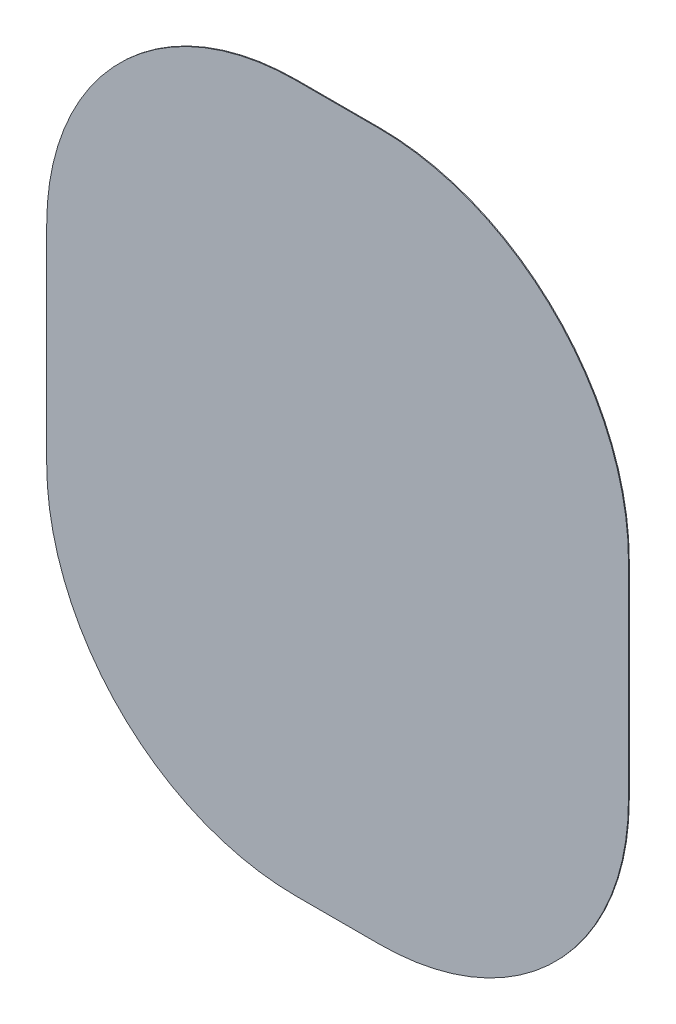
ISO-10303-21;
HEADER;
FILE_DESCRIPTION(('STEP AP214'),'2;1');
FILE_NAME('part.step','',(''),(''),'','','');
FILE_SCHEMA(('AUTOMOTIVE_DESIGN { 1 0 10303 214 1 1 1 1 }'));
ENDSEC;
DATA;
#1=APPLICATION_CONTEXT('core data for automotive mechanical design processes');
#2=APPLICATION_PROTOCOL_DEFINITION('international standard','automotive_design',2000,#1);
#3=PRODUCT_CONTEXT('',#1,'mechanical');
#4=PRODUCT('Part','Part','',(#3));
#5=PRODUCT_RELATED_PRODUCT_CATEGORY('part','',(#4));
#6=PRODUCT_DEFINITION_FORMATION('','',#4);
#7=PRODUCT_DEFINITION_CONTEXT('part definition',#1,'design');
#8=PRODUCT_DEFINITION('design','',#6,#7);
#9=PRODUCT_DEFINITION_SHAPE('','',#8);
#10=(LENGTH_UNIT() NAMED_UNIT(*) SI_UNIT(.MILLI.,.METRE.));
#11=(NAMED_UNIT(*) PLANE_ANGLE_UNIT() SI_UNIT($,.RADIAN.));
#12=(NAMED_UNIT(*) SI_UNIT($,.STERADIAN.) SOLID_ANGLE_UNIT());
#13=UNCERTAINTY_MEASURE_WITH_UNIT(LENGTH_MEASURE(1.E-05),#10,'distance_accuracy_value','');
#14=(GEOMETRIC_REPRESENTATION_CONTEXT(3) GLOBAL_UNCERTAINTY_ASSIGNED_CONTEXT((#13)) GLOBAL_UNIT_ASSIGNED_CONTEXT((#10,
#11,#12)) REPRESENTATION_CONTEXT('',''));
#15=CARTESIAN_POINT('',(0.,0.,0.));
#16=DIRECTION('',(0.,0.,1.));
#17=DIRECTION('',(1.,0.,0.));
#18=AXIS2_PLACEMENT_3D('',#15,#16,#17);
#19=CARTESIAN_POINT('',(-4.99999999999998,-12.5,0.1));
#20=DIRECTION('',(0.,0.,-1.));
#21=DIRECTION('',(-1.,0.,0.));
#22=AXIS2_PLACEMENT_3D('',#19,#20,#21);
#23=CYLINDRICAL_SURFACE('',#22,30.);
#24=CARTESIAN_POINT('',(-4.99999999999998,-12.5,0.));
#25=DIRECTION('',(0.,0.,1.));
#26=DIRECTION('',(-1.,0.,0.));
#27=AXIS2_PLACEMENT_3D('',#24,#25,#26);
#28=CIRCLE('',#27,30.);
#29=CARTESIAN_POINT('',(-35.,-12.4999999999998,0.));
#30=VERTEX_POINT('',#29);
#31=CARTESIAN_POINT('',(-4.99999999999976,-42.5,0.));
#32=VERTEX_POINT('',#31);
#33=EDGE_CURVE('E137',#30,#32,#28,.T.);
#34=ORIENTED_EDGE('',*,*,#33,.T.);
#35=DIRECTION('',(0.,0.,-1.));
#36=VECTOR('',#35,1.);
#37=CARTESIAN_POINT('',(-4.99999999999976,-42.5,0.1));
#38=LINE('',#37,#36);
#39=CARTESIAN_POINT('',(-4.99999999999976,-42.5,0.1));
#40=VERTEX_POINT('',#39);
#41=EDGE_CURVE('E11',#40,#32,#38,.T.);
#42=ORIENTED_EDGE('',*,*,#41,.F.);
#43=CARTESIAN_POINT('',(-4.99999999999998,-12.5,0.1));
#44=DIRECTION('',(0.,0.,1.));
#45=DIRECTION('',(-1.,0.,0.));
#46=AXIS2_PLACEMENT_3D('',#43,#44,#45);
#47=CIRCLE('',#46,30.);
#48=CARTESIAN_POINT('',(-35.,-12.4999999999998,0.1));
#49=VERTEX_POINT('',#48);
#50=EDGE_CURVE('E154',#49,#40,#47,.T.);
#51=ORIENTED_EDGE('',*,*,#50,.F.);
#52=DIRECTION('',(0.,0.,-1.));
#53=VECTOR('',#52,1.);
#54=CARTESIAN_POINT('',(-35.,-12.4999999999998,0.1));
#55=LINE('',#54,#53);
#56=EDGE_CURVE('E134',#49,#30,#55,.T.);
#57=ORIENTED_EDGE('',*,*,#56,.T.);
#58=EDGE_LOOP('',(#34,#42,#51,#57));
#59=FACE_BOUND('',#58,.T.);
#60=ADVANCED_FACE('F43',(#59),#23,.T.);
#61=CARTESIAN_POINT('',(4.99999999999981,-42.5,0.1));
#62=DIRECTION('',(0.,1.,0.));
#63=DIRECTION('',(0.,0.,1.));
#64=AXIS2_PLACEMENT_3D('',#61,#62,#63);
#65=PLANE('',#64);
#66=DIRECTION('',(1.,0.,0.));
#67=VECTOR('',#66,1.);
#68=CARTESIAN_POINT('',(4.99999999999981,-42.5,0.));
#69=LINE('',#68,#67);
#70=CARTESIAN_POINT('',(4.99999999999981,-42.5,0.));
#71=VERTEX_POINT('',#70);
#72=EDGE_CURVE('E145',#32,#71,#69,.T.);
#73=ORIENTED_EDGE('',*,*,#72,.T.);
#74=DIRECTION('',(0.,0.,-1.));
#75=VECTOR('',#74,1.);
#76=CARTESIAN_POINT('',(4.99999999999981,-42.5,0.1));
#77=LINE('',#76,#75);
#78=CARTESIAN_POINT('',(4.99999999999981,-42.5,0.1));
#79=VERTEX_POINT('',#78);
#80=EDGE_CURVE('E51',#79,#71,#77,.T.);
#81=ORIENTED_EDGE('',*,*,#80,.F.);
#82=DIRECTION('',(1.,0.,0.));
#83=VECTOR('',#82,1.);
#84=CARTESIAN_POINT('',(4.99999999999981,-42.5,0.1));
#85=LINE('',#84,#83);
#86=EDGE_CURVE('E105',#40,#79,#85,.T.);
#87=ORIENTED_EDGE('',*,*,#86,.F.);
#88=ORIENTED_EDGE('',*,*,#41,.T.);
#89=EDGE_LOOP('',(#73,#81,#87,#88));
#90=FACE_BOUND('',#89,.T.);
#91=ADVANCED_FACE('F187',(#90),#65,.F.);
#92=CARTESIAN_POINT('',(5.00000000000002,-12.5,0.1));
#93=DIRECTION('',(0.,0.,-1.));
#94=DIRECTION('',(-1.,0.,0.));
#95=AXIS2_PLACEMENT_3D('',#92,#93,#94);
#96=CYLINDRICAL_SURFACE('',#95,30.);
#97=CARTESIAN_POINT('',(5.00000000000002,-12.5,0.));
#98=DIRECTION('',(0.,0.,1.));
#99=DIRECTION('',(1.,0.,0.));
#100=AXIS2_PLACEMENT_3D('',#97,#98,#99);
#101=CIRCLE('',#100,30.);
#102=CARTESIAN_POINT('',(35.,-12.5,0.));
#103=VERTEX_POINT('',#102);
#104=EDGE_CURVE('E143',#71,#103,#101,.T.);
#105=ORIENTED_EDGE('',*,*,#104,.T.);
#106=DIRECTION('',(0.,0.,-1.));
#107=VECTOR('',#106,1.);
#108=CARTESIAN_POINT('',(35.,-12.5,0.1));
#109=LINE('',#108,#107);
#110=CARTESIAN_POINT('',(35.,-12.5,0.1));
#111=VERTEX_POINT('',#110);
#112=EDGE_CURVE('E158',#111,#103,#109,.T.);
#113=ORIENTED_EDGE('',*,*,#112,.F.);
#114=CARTESIAN_POINT('',(5.00000000000002,-12.5,0.1));
#115=DIRECTION('',(0.,0.,1.));
#116=DIRECTION('',(1.,0.,0.));
#117=AXIS2_PLACEMENT_3D('',#114,#115,#116);
#118=CIRCLE('',#117,30.);
#119=EDGE_CURVE('E166',#79,#111,#118,.T.);
#120=ORIENTED_EDGE('',*,*,#119,.F.);
#121=ORIENTED_EDGE('',*,*,#80,.T.);
#122=EDGE_LOOP('',(#105,#113,#120,#121));
#123=FACE_BOUND('',#122,.T.);
#124=ADVANCED_FACE('F168',(#123),#96,.T.);
#125=CARTESIAN_POINT('',(35.,-12.4999999999998,0.1));
#126=DIRECTION('',(-1.,0.,0.));
#127=DIRECTION('',(0.,0.,1.));
#128=AXIS2_PLACEMENT_3D('',#125,#126,#127);
#129=PLANE('',#128);
#130=DIRECTION('',(0.,1.,0.));
#131=VECTOR('',#130,1.);
#132=CARTESIAN_POINT('',(35.,-12.4999999999998,0.));
#133=LINE('',#132,#131);
#134=CARTESIAN_POINT('',(35.,12.4999999999998,0.));
#135=VERTEX_POINT('',#134);
#136=EDGE_CURVE('E147',#103,#135,#133,.T.);
#137=ORIENTED_EDGE('',*,*,#136,.T.);
#138=DIRECTION('',(0.,0.,-1.));
#139=VECTOR('',#138,1.);
#140=CARTESIAN_POINT('',(35.,12.4999999999998,0.1));
#141=LINE('',#140,#139);
#142=CARTESIAN_POINT('',(35.,12.4999999999998,0.1));
#143=VERTEX_POINT('',#142);
#144=EDGE_CURVE('E160',#143,#135,#141,.T.);
#145=ORIENTED_EDGE('',*,*,#144,.F.);
#146=DIRECTION('',(0.,1.,0.));
#147=VECTOR('',#146,1.);
#148=CARTESIAN_POINT('',(35.,-12.4999999999998,0.1));
#149=LINE('',#148,#147);
#150=EDGE_CURVE('E179',#111,#143,#149,.T.);
#151=ORIENTED_EDGE('',*,*,#150,.F.);
#152=ORIENTED_EDGE('',*,*,#112,.T.);
#153=EDGE_LOOP('',(#137,#145,#151,#152));
#154=FACE_BOUND('',#153,.T.);
#155=ADVANCED_FACE('F176',(#154),#129,.F.);
#156=CARTESIAN_POINT('',(5.00000000000003,12.5,0.1));
#157=DIRECTION('',(0.,0.,-1.));
#158=DIRECTION('',(-1.,0.,0.));
#159=AXIS2_PLACEMENT_3D('',#156,#157,#158);
#160=CYLINDRICAL_SURFACE('',#159,30.);
#161=CARTESIAN_POINT('',(5.00000000000003,12.5,0.));
#162=DIRECTION('',(0.,0.,1.));
#163=DIRECTION('',(1.,0.,0.));
#164=AXIS2_PLACEMENT_3D('',#161,#162,#163);
#165=CIRCLE('',#164,30.);
#166=CARTESIAN_POINT('',(4.99999999999982,42.5,0.));
#167=VERTEX_POINT('',#166);
#168=EDGE_CURVE('E149',#135,#167,#165,.T.);
#169=ORIENTED_EDGE('',*,*,#168,.T.);
#170=DIRECTION('',(0.,0.,-1.));
#171=VECTOR('',#170,1.);
#172=CARTESIAN_POINT('',(4.99999999999982,42.5,0.1));
#173=LINE('',#172,#171);
#174=CARTESIAN_POINT('',(4.99999999999982,42.5,0.1));
#175=VERTEX_POINT('',#174);
#176=EDGE_CURVE('E127',#175,#167,#173,.T.);
#177=ORIENTED_EDGE('',*,*,#176,.F.);
#178=CARTESIAN_POINT('',(5.00000000000003,12.5,0.1));
#179=DIRECTION('',(0.,0.,1.));
#180=DIRECTION('',(1.,0.,0.));
#181=AXIS2_PLACEMENT_3D('',#178,#179,#180);
#182=CIRCLE('',#181,30.);
#183=EDGE_CURVE('E123',#143,#175,#182,.T.);
#184=ORIENTED_EDGE('',*,*,#183,.F.);
#185=ORIENTED_EDGE('',*,*,#144,.T.);
#186=EDGE_LOOP('',(#169,#177,#184,#185));
#187=FACE_BOUND('',#186,.T.);
#188=ADVANCED_FACE('F177',(#187),#160,.T.);
#189=CARTESIAN_POINT('',(4.99999999999981,42.5,0.1));
#190=DIRECTION('',(0.,-1.,0.));
#191=DIRECTION('',(0.,0.,-1.));
#192=AXIS2_PLACEMENT_3D('',#189,#190,#191);
#193=PLANE('',#192);
#194=DIRECTION('',(-1.,0.,0.));
#195=VECTOR('',#194,1.);
#196=CARTESIAN_POINT('',(4.99999999999981,42.5,0.));
#197=LINE('',#196,#195);
#198=CARTESIAN_POINT('',(-4.99999999999977,42.5,0.));
#199=VERTEX_POINT('',#198);
#200=EDGE_CURVE('E129',#167,#199,#197,.T.);
#201=ORIENTED_EDGE('',*,*,#200,.T.);
#202=DIRECTION('',(0.,0.,-1.));
#203=VECTOR('',#202,1.);
#204=CARTESIAN_POINT('',(-4.99999999999977,42.5,0.1));
#205=LINE('',#204,#203);
#206=CARTESIAN_POINT('',(-4.99999999999977,42.5,0.1));
#207=VERTEX_POINT('',#206);
#208=EDGE_CURVE('E128',#207,#199,#205,.T.);
#209=ORIENTED_EDGE('',*,*,#208,.F.);
#210=DIRECTION('',(-1.,0.,0.));
#211=VECTOR('',#210,1.);
#212=CARTESIAN_POINT('',(4.99999999999981,42.5,0.1));
#213=LINE('',#212,#211);
#214=EDGE_CURVE('E113',#175,#207,#213,.T.);
#215=ORIENTED_EDGE('',*,*,#214,.F.);
#216=ORIENTED_EDGE('',*,*,#176,.T.);
#217=EDGE_LOOP('',(#201,#209,#215,#216));
#218=FACE_BOUND('',#217,.T.);
#219=ADVANCED_FACE('F130',(#218),#193,.F.);
#220=CARTESIAN_POINT('',(-4.99999999999999,12.5,0.1));
#221=DIRECTION('',(0.,0.,-1.));
#222=DIRECTION('',(-1.,0.,0.));
#223=AXIS2_PLACEMENT_3D('',#220,#221,#222);
#224=CYLINDRICAL_SURFACE('',#223,30.);
#225=CARTESIAN_POINT('',(-4.99999999999999,12.5,0.));
#226=DIRECTION('',(0.,0.,1.));
#227=DIRECTION('',(1.,0.,0.));
#228=AXIS2_PLACEMENT_3D('',#225,#226,#227);
#229=CIRCLE('',#228,30.);
#230=CARTESIAN_POINT('',(-35.,12.4999999999998,0.));
#231=VERTEX_POINT('',#230);
#232=EDGE_CURVE('E88',#199,#231,#229,.T.);
#233=ORIENTED_EDGE('',*,*,#232,.T.);
#234=DIRECTION('',(0.,0.,-1.));
#235=VECTOR('',#234,1.);
#236=CARTESIAN_POINT('',(-35.,12.4999999999998,0.1));
#237=LINE('',#236,#235);
#238=CARTESIAN_POINT('',(-35.,12.4999999999998,0.1));
#239=VERTEX_POINT('',#238);
#240=EDGE_CURVE('E131',#239,#231,#237,.T.);
#241=ORIENTED_EDGE('',*,*,#240,.F.);
#242=CARTESIAN_POINT('',(-4.99999999999999,12.5,0.1));
#243=DIRECTION('',(0.,0.,1.));
#244=DIRECTION('',(1.,0.,0.));
#245=AXIS2_PLACEMENT_3D('',#242,#243,#244);
#246=CIRCLE('',#245,30.);
#247=EDGE_CURVE('E118',#207,#239,#246,.T.);
#248=ORIENTED_EDGE('',*,*,#247,.F.);
#249=ORIENTED_EDGE('',*,*,#208,.T.);
#250=EDGE_LOOP('',(#233,#241,#248,#249));
#251=FACE_BOUND('',#250,.T.);
#252=ADVANCED_FACE('F133',(#251),#224,.T.);
#253=CARTESIAN_POINT('',(-35.,-12.4999999999998,0.1));
#254=DIRECTION('',(1.,0.,0.));
#255=DIRECTION('',(0.,0.,-1.));
#256=AXIS2_PLACEMENT_3D('',#253,#254,#255);
#257=PLANE('',#256);
#258=DIRECTION('',(0.,-1.,0.));
#259=VECTOR('',#258,1.);
#260=CARTESIAN_POINT('',(-35.,-12.4999999999998,0.));
#261=LINE('',#260,#259);
#262=EDGE_CURVE('E92',#231,#30,#261,.T.);
#263=ORIENTED_EDGE('',*,*,#262,.T.);
#264=ORIENTED_EDGE('',*,*,#56,.F.);
#265=DIRECTION('',(0.,-1.,0.));
#266=VECTOR('',#265,1.);
#267=CARTESIAN_POINT('',(-35.,-12.4999999999998,0.1));
#268=LINE('',#267,#266);
#269=EDGE_CURVE('E56',#239,#49,#268,.T.);
#270=ORIENTED_EDGE('',*,*,#269,.F.);
#271=ORIENTED_EDGE('',*,*,#240,.T.);
#272=EDGE_LOOP('',(#263,#264,#270,#271));
#273=FACE_BOUND('',#272,.T.);
#274=ADVANCED_FACE('F204',(#273),#257,.F.);
#275=CARTESIAN_POINT('',(-4.99999999999998,-12.5,0.1));
#276=DIRECTION('',(0.,0.,-1.));
#277=DIRECTION('',(-1.,0.,0.));
#278=AXIS2_PLACEMENT_3D('',#275,#276,#277);
#279=PLANE('',#278);
#280=ORIENTED_EDGE('',*,*,#50,.T.);
#281=ORIENTED_EDGE('',*,*,#86,.T.);
#282=ORIENTED_EDGE('',*,*,#119,.T.);
#283=ORIENTED_EDGE('',*,*,#150,.T.);
#284=ORIENTED_EDGE('',*,*,#183,.T.);
#285=ORIENTED_EDGE('',*,*,#214,.T.);
#286=ORIENTED_EDGE('',*,*,#247,.T.);
#287=ORIENTED_EDGE('',*,*,#269,.T.);
#288=EDGE_LOOP('',(#280,#281,#282,#283,#284,#285,#286,#287));
#289=FACE_BOUND('',#288,.T.);
#290=ADVANCED_FACE('F117',(#289),#279,.F.);
#291=CARTESIAN_POINT('',(-4.99999999999998,-12.5,0.));
#292=DIRECTION('',(0.,0.,-1.));
#293=DIRECTION('',(-1.,0.,0.));
#294=AXIS2_PLACEMENT_3D('',#291,#292,#293);
#295=PLANE('',#294);
#296=ORIENTED_EDGE('',*,*,#33,.F.);
#297=ORIENTED_EDGE('',*,*,#262,.F.);
#298=ORIENTED_EDGE('',*,*,#232,.F.);
#299=ORIENTED_EDGE('',*,*,#200,.F.);
#300=ORIENTED_EDGE('',*,*,#168,.F.);
#301=ORIENTED_EDGE('',*,*,#136,.F.);
#302=ORIENTED_EDGE('',*,*,#104,.F.);
#303=ORIENTED_EDGE('',*,*,#72,.F.);
#304=EDGE_LOOP('',(#296,#297,#298,#299,#300,#301,#302,#303));
#305=FACE_BOUND('',#304,.T.);
#306=ADVANCED_FACE('F175',(#305),#295,.T.);
#307=CLOSED_SHELL('',(#60,#91,#124,#155,#188,#219,#252,#274,#290,#306));
#308=MANIFOLD_SOLID_BREP('B2',#307);
#309=ADVANCED_BREP_SHAPE_REPRESENTATION('',(#18,#308),#14);
#310=SHAPE_DEFINITION_REPRESENTATION(#9,#309);
ENDSEC;
END-ISO-10303-21;
